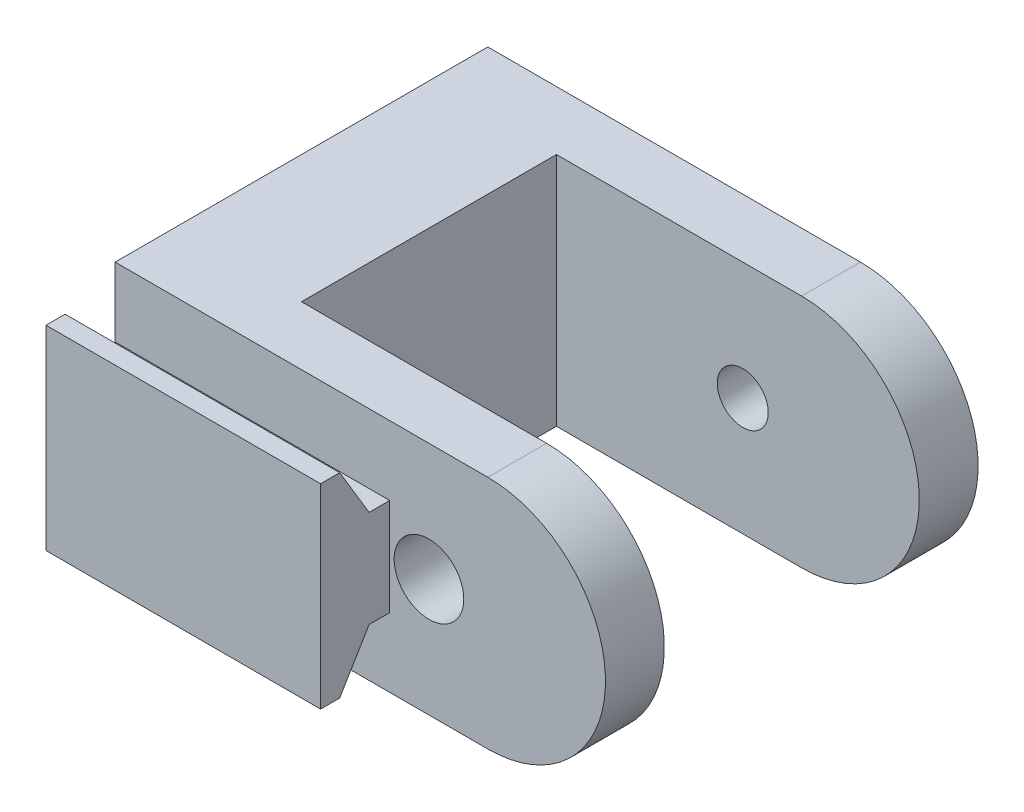
ISO-10303-21;
HEADER;
FILE_DESCRIPTION(('STEP AP214'),'2;1');
FILE_NAME('part.step','',(''),(''),'','','');
FILE_SCHEMA(('AUTOMOTIVE_DESIGN { 1 0 10303 214 1 1 1 1 }'));
ENDSEC;
DATA;
#1=APPLICATION_CONTEXT('core data for automotive mechanical design processes');
#2=APPLICATION_PROTOCOL_DEFINITION('international standard','automotive_design',2000,#1);
#3=PRODUCT_CONTEXT('',#1,'mechanical');
#4=PRODUCT('Part','Part','',(#3));
#5=PRODUCT_RELATED_PRODUCT_CATEGORY('part','',(#4));
#6=PRODUCT_DEFINITION_FORMATION('','',#4);
#7=PRODUCT_DEFINITION_CONTEXT('part definition',#1,'design');
#8=PRODUCT_DEFINITION('design','',#6,#7);
#9=PRODUCT_DEFINITION_SHAPE('','',#8);
#10=(LENGTH_UNIT() NAMED_UNIT(*) SI_UNIT(.MILLI.,.METRE.));
#11=(NAMED_UNIT(*) PLANE_ANGLE_UNIT() SI_UNIT($,.RADIAN.));
#12=(NAMED_UNIT(*) SI_UNIT($,.STERADIAN.) SOLID_ANGLE_UNIT());
#13=UNCERTAINTY_MEASURE_WITH_UNIT(LENGTH_MEASURE(1.E-05),#10,'distance_accuracy_value','');
#14=(GEOMETRIC_REPRESENTATION_CONTEXT(3) GLOBAL_UNCERTAINTY_ASSIGNED_CONTEXT((#13)) GLOBAL_UNIT_ASSIGNED_CONTEXT((#10,
#11,#12)) REPRESENTATION_CONTEXT('',''));
#15=CARTESIAN_POINT('',(0.,0.,0.));
#16=DIRECTION('',(0.,0.,1.));
#17=DIRECTION('',(1.,0.,0.));
#18=AXIS2_PLACEMENT_3D('',#15,#16,#17);
#19=CARTESIAN_POINT('',(0.,24.,0.));
#20=DIRECTION('',(0.,0.,-1.));
#21=DIRECTION('',(-1.,0.,0.));
#22=AXIS2_PLACEMENT_3D('',#19,#20,#21);
#23=PLANE('',#22);
#24=CARTESIAN_POINT('',(32.,12.,0.));
#25=DIRECTION('',(0.,0.,1.));
#26=DIRECTION('',(1.,0.,0.));
#27=AXIS2_PLACEMENT_3D('',#24,#25,#26);
#28=CIRCLE('',#27,3.55);
#29=CARTESIAN_POINT('',(35.55,12.,0.));
#30=VERTEX_POINT('',#29);
#31=EDGE_CURVE('E228',#30,#30,#28,.T.);
#32=ORIENTED_EDGE('',*,*,#31,.F.);
#33=EDGE_LOOP('',(#32));
#34=FACE_BOUND('',#33,.T.);
#35=DIRECTION('',(-1.,0.,0.));
#36=VECTOR('',#35,1.);
#37=CARTESIAN_POINT('',(28.,16.95,0.));
#38=LINE('',#37,#36);
#39=CARTESIAN_POINT('',(28.,16.95,0.));
#40=VERTEX_POINT('',#39);
#41=CARTESIAN_POINT('',(0.,16.95,0.));
#42=VERTEX_POINT('',#41);
#43=EDGE_CURVE('E176',#40,#42,#38,.T.);
#44=ORIENTED_EDGE('',*,*,#43,.F.);
#45=DIRECTION('',(0.,-1.,0.));
#46=VECTOR('',#45,1.);
#47=CARTESIAN_POINT('',(28.,16.95,0.));
#48=LINE('',#47,#46);
#49=CARTESIAN_POINT('',(28.,7.05,0.));
#50=VERTEX_POINT('',#49);
#51=EDGE_CURVE('E167',#40,#50,#48,.T.);
#52=ORIENTED_EDGE('',*,*,#51,.T.);
#53=DIRECTION('',(-1.,0.,0.));
#54=VECTOR('',#53,1.);
#55=CARTESIAN_POINT('',(28.,7.05,0.));
#56=LINE('',#55,#54);
#57=CARTESIAN_POINT('',(0.,7.05,0.));
#58=VERTEX_POINT('',#57);
#59=EDGE_CURVE('E152',#50,#58,#56,.T.);
#60=ORIENTED_EDGE('',*,*,#59,.T.);
#61=DIRECTION('',(0.,-1.,0.));
#62=VECTOR('',#61,1.);
#63=CARTESIAN_POINT('',(0.,24.,0.));
#64=LINE('',#63,#62);
#65=CARTESIAN_POINT('',(0.,0.,0.));
#66=VERTEX_POINT('',#65);
#67=EDGE_CURVE('E323',#58,#66,#64,.T.);
#68=ORIENTED_EDGE('',*,*,#67,.T.);
#69=DIRECTION('',(1.,0.,0.));
#70=VECTOR('',#69,1.);
#71=CARTESIAN_POINT('',(0.,0.,0.));
#72=LINE('',#71,#70);
#73=CARTESIAN_POINT('',(38.,0.,0.));
#74=VERTEX_POINT('',#73);
#75=EDGE_CURVE('E296',#66,#74,#72,.T.);
#76=ORIENTED_EDGE('',*,*,#75,.T.);
#77=CARTESIAN_POINT('',(38.,12.,0.));
#78=DIRECTION('',(0.,0.,-1.));
#79=DIRECTION('',(-1.,0.,0.));
#80=AXIS2_PLACEMENT_3D('',#77,#78,#79);
#81=CIRCLE('',#80,12.);
#82=CARTESIAN_POINT('',(38.,24.,0.));
#83=VERTEX_POINT('',#82);
#84=EDGE_CURVE('E64',#83,#74,#81,.T.);
#85=ORIENTED_EDGE('',*,*,#84,.F.);
#86=DIRECTION('',(1.,0.,0.));
#87=VECTOR('',#86,1.);
#88=CARTESIAN_POINT('',(0.,24.,0.));
#89=LINE('',#88,#87);
#90=CARTESIAN_POINT('',(0.,24.,0.));
#91=VERTEX_POINT('',#90);
#92=EDGE_CURVE('E274',#91,#83,#89,.T.);
#93=ORIENTED_EDGE('',*,*,#92,.F.);
#94=EDGE_CURVE('E324',#91,#42,#64,.T.);
#95=ORIENTED_EDGE('',*,*,#94,.T.);
#96=EDGE_LOOP('',(#44,#52,#60,#68,#76,#85,#93,#95));
#97=FACE_BOUND('',#96,.T.);
#98=ADVANCED_FACE('F39',(#34,#97),#23,.F.);
#99=CARTESIAN_POINT('',(50.,24.,-6.));
#100=DIRECTION('',(0.,0.,1.));
#101=DIRECTION('',(1.,0.,0.));
#102=AXIS2_PLACEMENT_3D('',#99,#100,#101);
#103=PLANE('',#102);
#104=CARTESIAN_POINT('',(32.,12.,-6.));
#105=DIRECTION('',(0.,0.,1.));
#106=DIRECTION('',(1.,0.,0.));
#107=AXIS2_PLACEMENT_3D('',#104,#105,#106);
#108=CIRCLE('',#107,3.55);
#109=CARTESIAN_POINT('',(35.55,12.,-6.));
#110=VERTEX_POINT('',#109);
#111=EDGE_CURVE('E43',#110,#110,#108,.T.);
#112=ORIENTED_EDGE('',*,*,#111,.T.);
#113=EDGE_LOOP('',(#112));
#114=FACE_BOUND('',#113,.T.);
#115=DIRECTION('',(-1.,0.,0.));
#116=VECTOR('',#115,1.);
#117=CARTESIAN_POINT('',(50.,24.,-6.));
#118=LINE('',#117,#116);
#119=CARTESIAN_POINT('',(38.,24.,-6.));
#120=VERTEX_POINT('',#119);
#121=CARTESIAN_POINT('',(13.,24.,-6.));
#122=VERTEX_POINT('',#121);
#123=EDGE_CURVE('E279',#120,#122,#118,.T.);
#124=ORIENTED_EDGE('',*,*,#123,.F.);
#125=CARTESIAN_POINT('',(38.,12.,-6.));
#126=DIRECTION('',(0.,0.,1.));
#127=DIRECTION('',(1.,0.,0.));
#128=AXIS2_PLACEMENT_3D('',#125,#126,#127);
#129=CIRCLE('',#128,12.);
#130=CARTESIAN_POINT('',(38.,0.,-6.));
#131=VERTEX_POINT('',#130);
#132=EDGE_CURVE('E264',#131,#120,#129,.T.);
#133=ORIENTED_EDGE('',*,*,#132,.F.);
#134=DIRECTION('',(-1.,0.,0.));
#135=VECTOR('',#134,1.);
#136=CARTESIAN_POINT('',(50.,0.,-6.));
#137=LINE('',#136,#135);
#138=CARTESIAN_POINT('',(13.,0.,-6.));
#139=VERTEX_POINT('',#138);
#140=EDGE_CURVE('E300',#131,#139,#137,.T.);
#141=ORIENTED_EDGE('',*,*,#140,.T.);
#142=DIRECTION('',(0.,-1.,0.));
#143=VECTOR('',#142,1.);
#144=CARTESIAN_POINT('',(13.,24.,-6.));
#145=LINE('',#144,#143);
#146=EDGE_CURVE('E319',#122,#139,#145,.T.);
#147=ORIENTED_EDGE('',*,*,#146,.F.);
#148=EDGE_LOOP('',(#124,#133,#141,#147));
#149=FACE_BOUND('',#148,.T.);
#150=ADVANCED_FACE('F340',(#114,#149),#103,.F.);
#151=CARTESIAN_POINT('',(13.,24.,-32.));
#152=DIRECTION('',(0.,0.,-1.));
#153=DIRECTION('',(-1.,0.,0.));
#154=AXIS2_PLACEMENT_3D('',#151,#152,#153);
#155=PLANE('',#154);
#156=CARTESIAN_POINT('',(32.,12.,-32.));
#157=DIRECTION('',(0.,0.,-1.));
#158=DIRECTION('',(-1.,0.,0.));
#159=AXIS2_PLACEMENT_3D('',#156,#157,#158);
#160=CIRCLE('',#159,2.6);
#161=CARTESIAN_POINT('',(29.4,12.,-32.));
#162=VERTEX_POINT('',#161);
#163=EDGE_CURVE('E253',#162,#162,#160,.T.);
#164=ORIENTED_EDGE('',*,*,#163,.T.);
#165=EDGE_LOOP('',(#164));
#166=FACE_BOUND('',#165,.T.);
#167=CARTESIAN_POINT('',(38.,12.,-32.));
#168=DIRECTION('',(0.,0.,-1.));
#169=DIRECTION('',(-1.,0.,0.));
#170=AXIS2_PLACEMENT_3D('',#167,#168,#169);
#171=CIRCLE('',#170,12.);
#172=CARTESIAN_POINT('',(38.,24.,-32.));
#173=VERTEX_POINT('',#172);
#174=CARTESIAN_POINT('',(38.,0.,-32.));
#175=VERTEX_POINT('',#174);
#176=EDGE_CURVE('E261',#173,#175,#171,.T.);
#177=ORIENTED_EDGE('',*,*,#176,.F.);
#178=DIRECTION('',(1.,0.,0.));
#179=VECTOR('',#178,1.);
#180=CARTESIAN_POINT('',(13.,24.,-32.));
#181=LINE('',#180,#179);
#182=CARTESIAN_POINT('',(13.,24.,-32.));
#183=VERTEX_POINT('',#182);
#184=EDGE_CURVE('E285',#183,#173,#181,.T.);
#185=ORIENTED_EDGE('',*,*,#184,.F.);
#186=DIRECTION('',(0.,-1.,0.));
#187=VECTOR('',#186,1.);
#188=CARTESIAN_POINT('',(13.,24.,-32.));
#189=LINE('',#188,#187);
#190=CARTESIAN_POINT('',(13.,0.,-32.));
#191=VERTEX_POINT('',#190);
#192=EDGE_CURVE('E315',#183,#191,#189,.T.);
#193=ORIENTED_EDGE('',*,*,#192,.T.);
#194=DIRECTION('',(1.,0.,0.));
#195=VECTOR('',#194,1.);
#196=CARTESIAN_POINT('',(13.,0.,-32.));
#197=LINE('',#196,#195);
#198=EDGE_CURVE('E306',#191,#175,#197,.T.);
#199=ORIENTED_EDGE('',*,*,#198,.T.);
#200=EDGE_LOOP('',(#177,#185,#193,#199));
#201=FACE_BOUND('',#200,.T.);
#202=ADVANCED_FACE('F352',(#166,#201),#155,.F.);
#203=CARTESIAN_POINT('',(50.,24.,-38.));
#204=DIRECTION('',(0.,0.,1.));
#205=DIRECTION('',(1.,0.,0.));
#206=AXIS2_PLACEMENT_3D('',#203,#204,#205);
#207=PLANE('',#206);
#208=CARTESIAN_POINT('',(32.,12.,-38.));
#209=DIRECTION('',(0.,0.,-1.));
#210=DIRECTION('',(-1.,0.,0.));
#211=AXIS2_PLACEMENT_3D('',#208,#209,#210);
#212=CIRCLE('',#211,2.6);
#213=CARTESIAN_POINT('',(29.4,12.,-38.));
#214=VERTEX_POINT('',#213);
#215=EDGE_CURVE('E249',#214,#214,#212,.T.);
#216=ORIENTED_EDGE('',*,*,#215,.F.);
#217=EDGE_LOOP('',(#216));
#218=FACE_BOUND('',#217,.T.);
#219=DIRECTION('',(-1.,0.,0.));
#220=VECTOR('',#219,1.);
#221=CARTESIAN_POINT('',(50.,24.,-38.));
#222=LINE('',#221,#220);
#223=CARTESIAN_POINT('',(38.,24.,-38.));
#224=VERTEX_POINT('',#223);
#225=CARTESIAN_POINT('',(0.,24.,-38.));
#226=VERTEX_POINT('',#225);
#227=EDGE_CURVE('E289',#224,#226,#222,.T.);
#228=ORIENTED_EDGE('',*,*,#227,.F.);
#229=CARTESIAN_POINT('',(38.,12.,-38.));
#230=DIRECTION('',(0.,0.,-1.));
#231=DIRECTION('',(-1.,0.,0.));
#232=AXIS2_PLACEMENT_3D('',#229,#230,#231);
#233=CIRCLE('',#232,12.);
#234=CARTESIAN_POINT('',(38.,0.,-38.));
#235=VERTEX_POINT('',#234);
#236=EDGE_CURVE('E257',#224,#235,#233,.T.);
#237=ORIENTED_EDGE('',*,*,#236,.T.);
#238=DIRECTION('',(-1.,0.,0.));
#239=VECTOR('',#238,1.);
#240=CARTESIAN_POINT('',(50.,0.,-38.));
#241=LINE('',#240,#239);
#242=CARTESIAN_POINT('',(0.,0.,-38.));
#243=VERTEX_POINT('',#242);
#244=EDGE_CURVE('E275',#235,#243,#241,.T.);
#245=ORIENTED_EDGE('',*,*,#244,.T.);
#246=DIRECTION('',(0.,-1.,0.));
#247=VECTOR('',#246,1.);
#248=CARTESIAN_POINT('',(0.,24.,-38.));
#249=LINE('',#248,#247);
#250=EDGE_CURVE('E292',#226,#243,#249,.T.);
#251=ORIENTED_EDGE('',*,*,#250,.F.);
#252=EDGE_LOOP('',(#228,#237,#245,#251));
#253=FACE_BOUND('',#252,.T.);
#254=ADVANCED_FACE('F364',(#218,#253),#207,.F.);
#255=CARTESIAN_POINT('',(0.,0.,0.));
#256=DIRECTION('',(0.,1.,0.));
#257=DIRECTION('',(0.,0.,1.));
#258=AXIS2_PLACEMENT_3D('',#255,#256,#257);
#259=PLANE('',#258);
#260=DIRECTION('',(0.,0.,-1.));
#261=VECTOR('',#260,1.);
#262=CARTESIAN_POINT('',(38.,0.,22.));
#263=LINE('',#262,#261);
#264=EDGE_CURVE('E329',#74,#131,#263,.T.);
#265=ORIENTED_EDGE('',*,*,#264,.F.);
#266=ORIENTED_EDGE('',*,*,#75,.F.);
#267=DIRECTION('',(0.,0.,1.));
#268=VECTOR('',#267,1.);
#269=CARTESIAN_POINT('',(0.,0.,-38.));
#270=LINE('',#269,#268);
#271=EDGE_CURVE('E269',#243,#66,#270,.T.);
#272=ORIENTED_EDGE('',*,*,#271,.F.);
#273=ORIENTED_EDGE('',*,*,#244,.F.);
#274=EDGE_CURVE('E327',#175,#235,#263,.T.);
#275=ORIENTED_EDGE('',*,*,#274,.F.);
#276=ORIENTED_EDGE('',*,*,#198,.F.);
#277=DIRECTION('',(0.,0.,-1.));
#278=VECTOR('',#277,1.);
#279=CARTESIAN_POINT('',(13.,0.,-6.));
#280=LINE('',#279,#278);
#281=EDGE_CURVE('E303',#139,#191,#280,.T.);
#282=ORIENTED_EDGE('',*,*,#281,.F.);
#283=ORIENTED_EDGE('',*,*,#140,.F.);
#284=EDGE_LOOP('',(#265,#266,#272,#273,#275,#276,#282,#283));
#285=FACE_BOUND('',#284,.T.);
#286=ADVANCED_FACE('F343',(#285),#259,.F.);
#287=CARTESIAN_POINT('',(0.,24.,-38.));
#288=DIRECTION('',(1.,0.,0.));
#289=DIRECTION('',(0.,0.,-1.));
#290=AXIS2_PLACEMENT_3D('',#287,#288,#289);
#291=PLANE('',#290);
#292=ORIENTED_EDGE('',*,*,#271,.T.);
#293=ORIENTED_EDGE('',*,*,#67,.F.);
#294=DIRECTION('',(0.,0.,1.));
#295=VECTOR('',#294,1.);
#296=CARTESIAN_POINT('',(0.,7.05,0.));
#297=LINE('',#296,#295);
#298=CARTESIAN_POINT('',(0.,7.05,2.1));
#299=VERTEX_POINT('',#298);
#300=EDGE_CURVE('E56',#58,#299,#297,.T.);
#301=ORIENTED_EDGE('',*,*,#300,.T.);
#302=DIRECTION('',(0.,-0.857492925712544,0.514495755427527));
#303=VECTOR('',#302,1.);
#304=CARTESIAN_POINT('',(0.,7.05,2.1));
#305=LINE('',#304,#303);
#306=CARTESIAN_POINT('',(0.,2.05,5.1));
#307=VERTEX_POINT('',#306);
#308=EDGE_CURVE('E207',#299,#307,#305,.T.);
#309=ORIENTED_EDGE('',*,*,#308,.T.);
#310=DIRECTION('',(0.,0.,1.));
#311=VECTOR('',#310,1.);
#312=CARTESIAN_POINT('',(0.,2.05,5.1));
#313=LINE('',#312,#311);
#314=CARTESIAN_POINT('',(0.,2.05,7.05));
#315=VERTEX_POINT('',#314);
#316=EDGE_CURVE('E211',#307,#315,#313,.T.);
#317=ORIENTED_EDGE('',*,*,#316,.T.);
#318=DIRECTION('',(0.,1.,0.));
#319=VECTOR('',#318,1.);
#320=CARTESIAN_POINT('',(0.,21.95,7.05));
#321=LINE('',#320,#319);
#322=CARTESIAN_POINT('',(0.,21.95,7.05));
#323=VERTEX_POINT('',#322);
#324=EDGE_CURVE('E215',#315,#323,#321,.T.);
#325=ORIENTED_EDGE('',*,*,#324,.T.);
#326=DIRECTION('',(0.,0.,-1.));
#327=VECTOR('',#326,1.);
#328=CARTESIAN_POINT('',(0.,21.95,5.1));
#329=LINE('',#328,#327);
#330=CARTESIAN_POINT('',(0.,21.95,5.1));
#331=VERTEX_POINT('',#330);
#332=EDGE_CURVE('E219',#323,#331,#329,.T.);
#333=ORIENTED_EDGE('',*,*,#332,.T.);
#334=DIRECTION('',(0.,-0.857492925712544,-0.514495755427527));
#335=VECTOR('',#334,1.);
#336=CARTESIAN_POINT('',(0.,16.95,2.1));
#337=LINE('',#336,#335);
#338=CARTESIAN_POINT('',(0.,16.95,2.1));
#339=VERTEX_POINT('',#338);
#340=EDGE_CURVE('E182',#331,#339,#337,.T.);
#341=ORIENTED_EDGE('',*,*,#340,.T.);
#342=DIRECTION('',(0.,0.,-1.));
#343=VECTOR('',#342,1.);
#344=CARTESIAN_POINT('',(0.,16.95,0.));
#345=LINE('',#344,#343);
#346=EDGE_CURVE('E178',#339,#42,#345,.T.);
#347=ORIENTED_EDGE('',*,*,#346,.T.);
#348=ORIENTED_EDGE('',*,*,#94,.F.);
#349=DIRECTION('',(0.,0.,1.));
#350=VECTOR('',#349,1.);
#351=CARTESIAN_POINT('',(0.,24.,-38.));
#352=LINE('',#351,#350);
#353=EDGE_CURVE('E270',#226,#91,#352,.T.);
#354=ORIENTED_EDGE('',*,*,#353,.F.);
#355=ORIENTED_EDGE('',*,*,#250,.T.);
#356=EDGE_LOOP('',(#292,#293,#301,#309,#317,#325,#333,#341,#347,#348,#354,#355));
#357=FACE_BOUND('',#356,.T.);
#358=ADVANCED_FACE('F41',(#357),#291,.F.);
#359=CARTESIAN_POINT('',(13.,24.,-6.));
#360=DIRECTION('',(-1.,0.,0.));
#361=DIRECTION('',(0.,0.,1.));
#362=AXIS2_PLACEMENT_3D('',#359,#360,#361);
#363=PLANE('',#362);
#364=ORIENTED_EDGE('',*,*,#281,.T.);
#365=ORIENTED_EDGE('',*,*,#192,.F.);
#366=DIRECTION('',(0.,0.,-1.));
#367=VECTOR('',#366,1.);
#368=CARTESIAN_POINT('',(13.,24.,-6.));
#369=LINE('',#368,#367);
#370=EDGE_CURVE('E282',#122,#183,#369,.T.);
#371=ORIENTED_EDGE('',*,*,#370,.F.);
#372=ORIENTED_EDGE('',*,*,#146,.T.);
#373=EDGE_LOOP('',(#364,#365,#371,#372));
#374=FACE_BOUND('',#373,.T.);
#375=ADVANCED_FACE('F348',(#374),#363,.F.);
#376=CARTESIAN_POINT('',(0.,24.,0.));
#377=DIRECTION('',(0.,1.,0.));
#378=DIRECTION('',(0.,0.,1.));
#379=AXIS2_PLACEMENT_3D('',#376,#377,#378);
#380=PLANE('',#379);
#381=DIRECTION('',(0.,0.,-1.));
#382=VECTOR('',#381,1.);
#383=CARTESIAN_POINT('',(38.,24.,22.));
#384=LINE('',#383,#382);
#385=EDGE_CURVE('E11',#224,#173,#384,.F.);
#386=ORIENTED_EDGE('',*,*,#385,.F.);
#387=ORIENTED_EDGE('',*,*,#227,.T.);
#388=ORIENTED_EDGE('',*,*,#353,.T.);
#389=ORIENTED_EDGE('',*,*,#92,.T.);
#390=EDGE_CURVE('E49',#120,#83,#384,.F.);
#391=ORIENTED_EDGE('',*,*,#390,.F.);
#392=ORIENTED_EDGE('',*,*,#123,.T.);
#393=ORIENTED_EDGE('',*,*,#370,.T.);
#394=ORIENTED_EDGE('',*,*,#184,.T.);
#395=EDGE_LOOP('',(#386,#387,#388,#389,#391,#392,#393,#394));
#396=FACE_BOUND('',#395,.T.);
#397=ADVANCED_FACE('F355',(#396),#380,.T.);
#398=CARTESIAN_POINT('',(38.,12.,22.));
#399=DIRECTION('',(0.,0.,-1.));
#400=DIRECTION('',(-1.,0.,0.));
#401=AXIS2_PLACEMENT_3D('',#398,#399,#400);
#402=CYLINDRICAL_SURFACE('',#401,12.);
#403=ORIENTED_EDGE('',*,*,#176,.T.);
#404=ORIENTED_EDGE('',*,*,#274,.T.);
#405=ORIENTED_EDGE('',*,*,#236,.F.);
#406=ORIENTED_EDGE('',*,*,#385,.T.);
#407=EDGE_LOOP('',(#403,#404,#405,#406));
#408=FACE_BOUND('',#407,.T.);
#409=ADVANCED_FACE('F366',(#408),#402,.T.);
#410=ORIENTED_EDGE('',*,*,#84,.T.);
#411=ORIENTED_EDGE('',*,*,#264,.T.);
#412=ORIENTED_EDGE('',*,*,#132,.T.);
#413=ORIENTED_EDGE('',*,*,#390,.T.);
#414=EDGE_LOOP('',(#410,#411,#412,#413));
#415=FACE_BOUND('',#414,.T.);
#416=ADVANCED_FACE('F334',(#415),#402,.T.);
#417=CARTESIAN_POINT('',(32.,12.,22.));
#418=DIRECTION('',(0.,0.,-1.));
#419=DIRECTION('',(-1.,0.,0.));
#420=AXIS2_PLACEMENT_3D('',#417,#418,#419);
#421=CYLINDRICAL_SURFACE('',#420,2.6);
#422=ORIENTED_EDGE('',*,*,#215,.T.);
#423=EDGE_LOOP('',(#422));
#424=FACE_BOUND('',#423,.T.);
#425=ORIENTED_EDGE('',*,*,#163,.F.);
#426=EDGE_LOOP('',(#425));
#427=FACE_BOUND('',#426,.T.);
#428=ADVANCED_FACE('F373',(#424,#427),#421,.F.);
#429=CARTESIAN_POINT('',(32.,12.,-10.));
#430=DIRECTION('',(0.,0.,1.));
#431=DIRECTION('',(1.,0.,0.));
#432=AXIS2_PLACEMENT_3D('',#429,#430,#431);
#433=CYLINDRICAL_SURFACE('',#432,3.55);
#434=ORIENTED_EDGE('',*,*,#31,.T.);
#435=EDGE_LOOP('',(#434));
#436=FACE_BOUND('',#435,.T.);
#437=ORIENTED_EDGE('',*,*,#111,.F.);
#438=EDGE_LOOP('',(#437));
#439=FACE_BOUND('',#438,.T.);
#440=ADVANCED_FACE('F433',(#436,#439),#433,.F.);
#441=CARTESIAN_POINT('',(28.,16.95,0.));
#442=DIRECTION('',(0.,1.,0.));
#443=DIRECTION('',(0.,0.,1.));
#444=AXIS2_PLACEMENT_3D('',#441,#442,#443);
#445=PLANE('',#444);
#446=ORIENTED_EDGE('',*,*,#346,.F.);
#447=DIRECTION('',(-1.,0.,0.));
#448=VECTOR('',#447,1.);
#449=CARTESIAN_POINT('',(28.,16.95,2.1));
#450=LINE('',#449,#448);
#451=CARTESIAN_POINT('',(28.,16.95,2.1));
#452=VERTEX_POINT('',#451);
#453=EDGE_CURVE('E229',#452,#339,#450,.T.);
#454=ORIENTED_EDGE('',*,*,#453,.F.);
#455=DIRECTION('',(0.,0.,-1.));
#456=VECTOR('',#455,1.);
#457=CARTESIAN_POINT('',(28.,16.95,0.));
#458=LINE('',#457,#456);
#459=EDGE_CURVE('E161',#452,#40,#458,.T.);
#460=ORIENTED_EDGE('',*,*,#459,.T.);
#461=ORIENTED_EDGE('',*,*,#43,.T.);
#462=EDGE_LOOP('',(#446,#454,#460,#461));
#463=FACE_BOUND('',#462,.T.);
#464=ADVANCED_FACE('F448',(#463),#445,.T.);
#465=CARTESIAN_POINT('',(28.,16.95,2.1));
#466=DIRECTION('',(0.,0.514495755427527,-0.857492925712544));
#467=DIRECTION('',(0.,0.857492925712544,0.514495755427527));
#468=AXIS2_PLACEMENT_3D('',#465,#466,#467);
#469=PLANE('',#468);
#470=ORIENTED_EDGE('',*,*,#340,.F.);
#471=DIRECTION('',(-1.,0.,0.));
#472=VECTOR('',#471,1.);
#473=CARTESIAN_POINT('',(28.,21.95,5.1));
#474=LINE('',#473,#472);
#475=CARTESIAN_POINT('',(28.,21.95,5.1));
#476=VERTEX_POINT('',#475);
#477=EDGE_CURVE('E232',#476,#331,#474,.T.);
#478=ORIENTED_EDGE('',*,*,#477,.F.);
#479=DIRECTION('',(0.,-0.857492925712544,-0.514495755427527));
#480=VECTOR('',#479,1.);
#481=CARTESIAN_POINT('',(28.,16.95,2.1));
#482=LINE('',#481,#480);
#483=EDGE_CURVE('E199',#476,#452,#482,.T.);
#484=ORIENTED_EDGE('',*,*,#483,.T.);
#485=ORIENTED_EDGE('',*,*,#453,.T.);
#486=EDGE_LOOP('',(#470,#478,#484,#485));
#487=FACE_BOUND('',#486,.T.);
#488=ADVANCED_FACE('F468',(#487),#469,.T.);
#489=CARTESIAN_POINT('',(28.,21.95,5.1));
#490=DIRECTION('',(0.,1.,0.));
#491=DIRECTION('',(0.,0.,1.));
#492=AXIS2_PLACEMENT_3D('',#489,#490,#491);
#493=PLANE('',#492);
#494=ORIENTED_EDGE('',*,*,#332,.F.);
#495=DIRECTION('',(-1.,0.,0.));
#496=VECTOR('',#495,1.);
#497=CARTESIAN_POINT('',(28.,21.95,7.05));
#498=LINE('',#497,#496);
#499=CARTESIAN_POINT('',(28.,21.95,7.05));
#500=VERTEX_POINT('',#499);
#501=EDGE_CURVE('E235',#500,#323,#498,.T.);
#502=ORIENTED_EDGE('',*,*,#501,.F.);
#503=DIRECTION('',(0.,0.,-1.));
#504=VECTOR('',#503,1.);
#505=CARTESIAN_POINT('',(28.,21.95,5.1));
#506=LINE('',#505,#504);
#507=EDGE_CURVE('E195',#500,#476,#506,.T.);
#508=ORIENTED_EDGE('',*,*,#507,.T.);
#509=ORIENTED_EDGE('',*,*,#477,.T.);
#510=EDGE_LOOP('',(#494,#502,#508,#509));
#511=FACE_BOUND('',#510,.T.);
#512=ADVANCED_FACE('F477',(#511),#493,.T.);
#513=CARTESIAN_POINT('',(28.,21.95,7.05));
#514=DIRECTION('',(0.,0.,1.));
#515=DIRECTION('',(1.,0.,0.));
#516=AXIS2_PLACEMENT_3D('',#513,#514,#515);
#517=PLANE('',#516);
#518=ORIENTED_EDGE('',*,*,#324,.F.);
#519=DIRECTION('',(-1.,0.,0.));
#520=VECTOR('',#519,1.);
#521=CARTESIAN_POINT('',(28.,2.05,7.05));
#522=LINE('',#521,#520);
#523=CARTESIAN_POINT('',(28.,2.05,7.05));
#524=VERTEX_POINT('',#523);
#525=EDGE_CURVE('E238',#524,#315,#522,.T.);
#526=ORIENTED_EDGE('',*,*,#525,.F.);
#527=DIRECTION('',(0.,1.,0.));
#528=VECTOR('',#527,1.);
#529=CARTESIAN_POINT('',(28.,21.95,7.05));
#530=LINE('',#529,#528);
#531=EDGE_CURVE('E191',#524,#500,#530,.T.);
#532=ORIENTED_EDGE('',*,*,#531,.T.);
#533=ORIENTED_EDGE('',*,*,#501,.T.);
#534=EDGE_LOOP('',(#518,#526,#532,#533));
#535=FACE_BOUND('',#534,.T.);
#536=ADVANCED_FACE('F486',(#535),#517,.T.);
#537=CARTESIAN_POINT('',(28.,2.05,5.1));
#538=DIRECTION('',(0.,-1.,0.));
#539=DIRECTION('',(0.,0.,-1.));
#540=AXIS2_PLACEMENT_3D('',#537,#538,#539);
#541=PLANE('',#540);
#542=ORIENTED_EDGE('',*,*,#316,.F.);
#543=DIRECTION('',(-1.,0.,0.));
#544=VECTOR('',#543,1.);
#545=CARTESIAN_POINT('',(28.,2.05,5.1));
#546=LINE('',#545,#544);
#547=CARTESIAN_POINT('',(28.,2.05,5.1));
#548=VERTEX_POINT('',#547);
#549=EDGE_CURVE('E241',#548,#307,#546,.T.);
#550=ORIENTED_EDGE('',*,*,#549,.F.);
#551=DIRECTION('',(0.,0.,1.));
#552=VECTOR('',#551,1.);
#553=CARTESIAN_POINT('',(28.,2.05,5.1));
#554=LINE('',#553,#552);
#555=EDGE_CURVE('E187',#548,#524,#554,.T.);
#556=ORIENTED_EDGE('',*,*,#555,.T.);
#557=ORIENTED_EDGE('',*,*,#525,.T.);
#558=EDGE_LOOP('',(#542,#550,#556,#557));
#559=FACE_BOUND('',#558,.T.);
#560=ADVANCED_FACE('F495',(#559),#541,.T.);
#561=CARTESIAN_POINT('',(28.,7.05,2.1));
#562=DIRECTION('',(0.,-0.514495755427527,-0.857492925712544));
#563=DIRECTION('',(0.,0.857492925712544,-0.514495755427527));
#564=AXIS2_PLACEMENT_3D('',#561,#562,#563);
#565=PLANE('',#564);
#566=ORIENTED_EDGE('',*,*,#308,.F.);
#567=DIRECTION('',(-1.,0.,0.));
#568=VECTOR('',#567,1.);
#569=CARTESIAN_POINT('',(28.,7.05,2.1));
#570=LINE('',#569,#568);
#571=CARTESIAN_POINT('',(28.,7.05,2.1));
#572=VERTEX_POINT('',#571);
#573=EDGE_CURVE('E160',#572,#299,#570,.T.);
#574=ORIENTED_EDGE('',*,*,#573,.F.);
#575=DIRECTION('',(0.,-0.857492925712544,0.514495755427527));
#576=VECTOR('',#575,1.);
#577=CARTESIAN_POINT('',(28.,7.05,2.1));
#578=LINE('',#577,#576);
#579=EDGE_CURVE('E171',#572,#548,#578,.T.);
#580=ORIENTED_EDGE('',*,*,#579,.T.);
#581=ORIENTED_EDGE('',*,*,#549,.T.);
#582=EDGE_LOOP('',(#566,#574,#580,#581));
#583=FACE_BOUND('',#582,.T.);
#584=ADVANCED_FACE('F504',(#583),#565,.T.);
#585=CARTESIAN_POINT('',(28.,7.05,0.));
#586=DIRECTION('',(0.,-1.,0.));
#587=DIRECTION('',(0.,0.,-1.));
#588=AXIS2_PLACEMENT_3D('',#585,#586,#587);
#589=PLANE('',#588);
#590=ORIENTED_EDGE('',*,*,#300,.F.);
#591=ORIENTED_EDGE('',*,*,#59,.F.);
#592=DIRECTION('',(0.,0.,1.));
#593=VECTOR('',#592,1.);
#594=CARTESIAN_POINT('',(28.,7.05,0.));
#595=LINE('',#594,#593);
#596=EDGE_CURVE('E155',#50,#572,#595,.T.);
#597=ORIENTED_EDGE('',*,*,#596,.T.);
#598=ORIENTED_EDGE('',*,*,#573,.T.);
#599=EDGE_LOOP('',(#590,#591,#597,#598));
#600=FACE_BOUND('',#599,.T.);
#601=ADVANCED_FACE('F154',(#600),#589,.T.);
#602=CARTESIAN_POINT('',(28.,0.,0.));
#603=DIRECTION('',(-1.,0.,0.));
#604=DIRECTION('',(0.,0.,1.));
#605=AXIS2_PLACEMENT_3D('',#602,#603,#604);
#606=PLANE('',#605);
#607=ORIENTED_EDGE('',*,*,#51,.F.);
#608=ORIENTED_EDGE('',*,*,#459,.F.);
#609=ORIENTED_EDGE('',*,*,#483,.F.);
#610=ORIENTED_EDGE('',*,*,#507,.F.);
#611=ORIENTED_EDGE('',*,*,#531,.F.);
#612=ORIENTED_EDGE('',*,*,#555,.F.);
#613=ORIENTED_EDGE('',*,*,#579,.F.);
#614=ORIENTED_EDGE('',*,*,#596,.F.);
#615=EDGE_LOOP('',(#607,#608,#609,#610,#611,#612,#613,#614));
#616=FACE_BOUND('',#615,.T.);
#617=ADVANCED_FACE('F165',(#616),#606,.F.);
#618=CLOSED_SHELL('',(#98,#150,#202,#254,#286,#358,#375,#397,#409,#416,#428,#440,#464,#488,#512,
#536,#560,#584,#601,#617));
#619=MANIFOLD_SOLID_BREP('B2',#618);
#620=ADVANCED_BREP_SHAPE_REPRESENTATION('',(#18,#619),#14);
#621=SHAPE_DEFINITION_REPRESENTATION(#9,#620);
ENDSEC;
END-ISO-10303-21;
